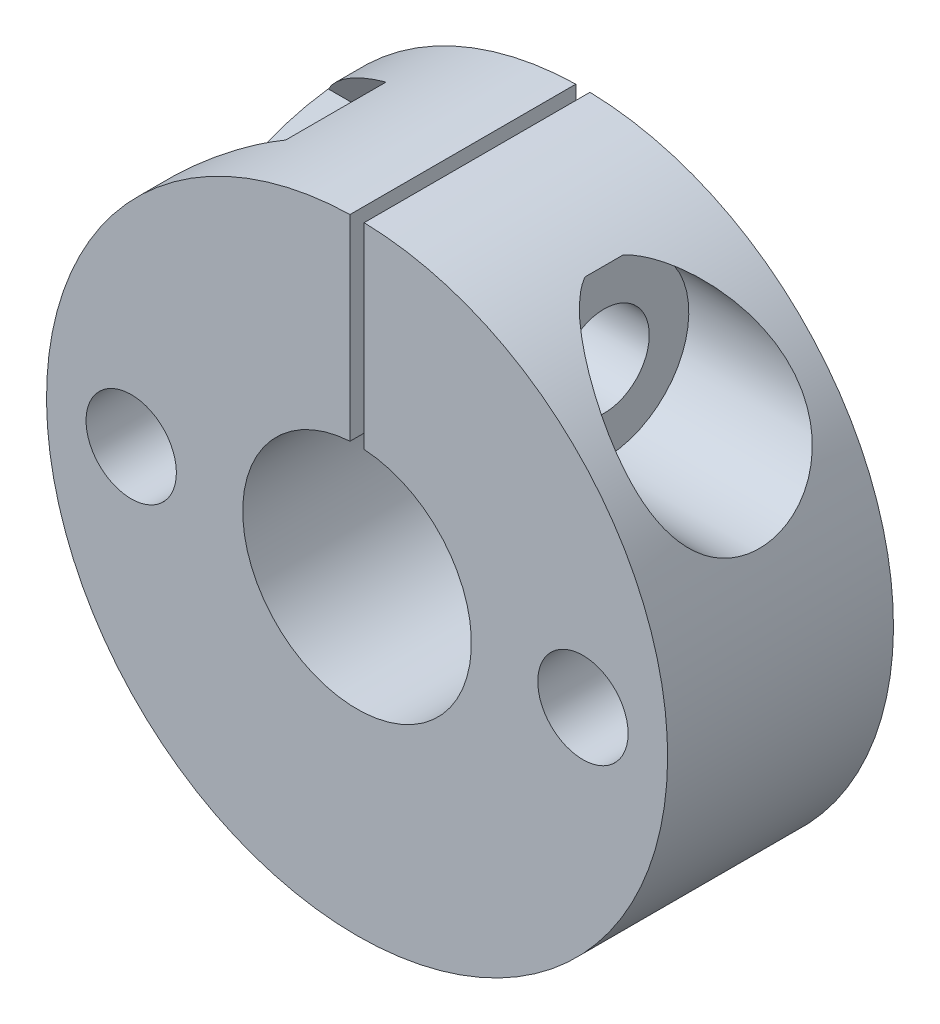
ISO-10303-21;
HEADER;
FILE_DESCRIPTION(('STEP AP214'),'2;1');
FILE_NAME('part.step','',(''),(''),'','','');
FILE_SCHEMA(('AUTOMOTIVE_DESIGN { 1 0 10303 214 1 1 1 1 }'));
ENDSEC;
DATA;
#1=APPLICATION_CONTEXT('core data for automotive mechanical design processes');
#2=APPLICATION_PROTOCOL_DEFINITION('international standard','automotive_design',2000,#1);
#3=PRODUCT_CONTEXT('',#1,'mechanical');
#4=PRODUCT('Part','Part','',(#3));
#5=PRODUCT_RELATED_PRODUCT_CATEGORY('part','',(#4));
#6=PRODUCT_DEFINITION_FORMATION('','',#4);
#7=PRODUCT_DEFINITION_CONTEXT('part definition',#1,'design');
#8=PRODUCT_DEFINITION('design','',#6,#7);
#9=PRODUCT_DEFINITION_SHAPE('','',#8);
#10=(LENGTH_UNIT() NAMED_UNIT(*) SI_UNIT(.MILLI.,.METRE.));
#11=(NAMED_UNIT(*) PLANE_ANGLE_UNIT() SI_UNIT($,.RADIAN.));
#12=(NAMED_UNIT(*) SI_UNIT($,.STERADIAN.) SOLID_ANGLE_UNIT());
#13=UNCERTAINTY_MEASURE_WITH_UNIT(LENGTH_MEASURE(1.E-05),#10,'distance_accuracy_value','');
#14=(GEOMETRIC_REPRESENTATION_CONTEXT(3) GLOBAL_UNCERTAINTY_ASSIGNED_CONTEXT((#13)) GLOBAL_UNIT_ASSIGNED_CONTEXT((#10,
#11,#12)) REPRESENTATION_CONTEXT('',''));
#15=CARTESIAN_POINT('',(0.,0.,0.));
#16=DIRECTION('',(0.,0.,1.));
#17=DIRECTION('',(1.,0.,0.));
#18=AXIS2_PLACEMENT_3D('',#15,#16,#17);
#19=CARTESIAN_POINT('',(0.,0.,8.));
#20=DIRECTION('',(0.,0.,-1.));
#21=DIRECTION('',(-1.,0.,0.));
#22=AXIS2_PLACEMENT_3D('',#19,#20,#21);
#23=CYLINDRICAL_SURFACE('',#22,11.);
#24=CARTESIAN_POINT('',(0.,0.,0.));
#25=DIRECTION('',(0.,0.,1.));
#26=DIRECTION('',(1.,0.,0.));
#27=AXIS2_PLACEMENT_3D('',#24,#25,#26);
#28=CIRCLE('',#27,11.);
#29=CARTESIAN_POINT('',(-0.25,10.9971587239614,0.));
#30=VERTEX_POINT('',#29);
#31=CARTESIAN_POINT('',(0.25,10.9971587239614,0.));
#32=VERTEX_POINT('',#31);
#33=EDGE_CURVE('E200',#30,#32,#28,.T.);
#34=ORIENTED_EDGE('',*,*,#33,.T.);
#35=DIRECTION('',(0.,0.,-1.));
#36=VECTOR('',#35,1.);
#37=CARTESIAN_POINT('',(0.25,10.9971587239614,8.));
#38=LINE('',#37,#36);
#39=CARTESIAN_POINT('',(0.25,10.9971587239614,8.));
#40=VERTEX_POINT('',#39);
#41=EDGE_CURVE('E206',#40,#32,#38,.T.);
#42=ORIENTED_EDGE('',*,*,#41,.F.);
#43=CARTESIAN_POINT('',(0.,0.,8.));
#44=DIRECTION('',(0.,0.,1.));
#45=DIRECTION('',(1.,0.,0.));
#46=AXIS2_PLACEMENT_3D('',#43,#44,#45);
#47=CIRCLE('',#46,11.);
#48=CARTESIAN_POINT('',(-0.25,10.9971587239614,8.));
#49=VERTEX_POINT('',#48);
#50=EDGE_CURVE('E186',#49,#40,#47,.T.);
#51=ORIENTED_EDGE('',*,*,#50,.F.);
#52=DIRECTION('',(0.,0.,-1.));
#53=VECTOR('',#52,1.);
#54=CARTESIAN_POINT('',(-0.25,10.9971587239614,8.));
#55=LINE('',#54,#53);
#56=EDGE_CURVE('E208',#49,#30,#55,.T.);
#57=ORIENTED_EDGE('',*,*,#56,.T.);
#58=EDGE_LOOP('',(#34,#42,#51,#57));
#59=FACE_BOUND('',#58,.T.);
#60=DIRECTION('',(0.,0.,-1.));
#61=VECTOR('',#60,1.);
#62=CARTESIAN_POINT('',(4.75,9.92156741649221,8.));
#63=LINE('',#62,#61);
#64=CARTESIAN_POINT('',(4.75,9.92156741649221,3.31849884013964));
#65=VERTEX_POINT('',#64);
#66=CARTESIAN_POINT('',(4.75,9.92156741649221,4.68150115986036));
#67=VERTEX_POINT('',#66);
#68=EDGE_CURVE('E212',#65,#67,#63,.F.);
#69=ORIENTED_EDGE('',*,*,#68,.F.);
#70=CARTESIAN_POINT('',(4.75,9.92156741649221,3.31849884013964));
#71=CARTESIAN_POINT('',(4.77022953811645,9.91188325670943,3.27699417539969));
#72=CARTESIAN_POINT('',(4.79181015938971,9.90147451358131,3.23635771362851));
#73=CARTESIAN_POINT('',(4.83723887895417,9.87936001471054,3.15679688138933));
#74=CARTESIAN_POINT('',(4.86108443262283,9.86765571212282,3.11787065977414));
#75=CARTESIAN_POINT('',(4.93519836182571,9.8309123152518,3.00385818391847));
#76=CARTESIAN_POINT('',(4.98824942404097,9.80414547360093,2.93113468938945));
#77=CARTESIAN_POINT('',(5.09877070098104,9.74712111644655,2.79214838970957));
#78=CARTESIAN_POINT('',(5.15618522884689,9.71690571677386,2.7258227464829));
#79=CARTESIAN_POINT('',(5.27455462621704,9.65316568511946,2.59792369143458));
#80=CARTESIAN_POINT('',(5.33551496823985,9.61963587882644,2.53635798637914));
#81=CARTESIAN_POINT('',(5.49981211330576,9.52710692300245,2.37932278922699));
#82=CARTESIAN_POINT('',(5.60520639277932,9.46558728264518,2.28749059186125));
#83=CARTESIAN_POINT('',(5.81955065230986,9.3353415897961,2.11374823811349));
#84=CARTESIAN_POINT('',(5.92850086532595,9.26661506450588,2.03183873345765));
#85=CARTESIAN_POINT('',(6.14917220305211,9.1216913965523,1.87636861110123));
#86=CARTESIAN_POINT('',(6.26090904879623,9.04543544388351,1.80288530271059));
#87=CARTESIAN_POINT('',(6.48497978971428,8.88616564793845,1.66472979996894));
#88=CARTESIAN_POINT('',(6.59731363720311,8.80315233703837,1.60005691256316));
#89=CARTESIAN_POINT('',(6.82837086122198,8.62530334316869,1.47594762315213));
#90=CARTESIAN_POINT('',(6.94707316725962,8.53005715519982,1.41705830668632));
#91=CARTESIAN_POINT('',(7.18312609047182,8.33225196723073,1.30968970912848));
#92=CARTESIAN_POINT('',(7.30047652415987,8.22969198781893,1.26121182576258));
#93=CARTESIAN_POINT('',(7.53242427552854,8.01792489866017,1.17567585952246));
#94=CARTESIAN_POINT('',(7.64703097696231,7.90874705405691,1.13857134692931));
#95=CARTESIAN_POINT('',(7.87298408813309,7.68385158575259,1.07665298181115));
#96=CARTESIAN_POINT('',(7.98433168759762,7.56813639485919,1.05183459026138));
#97=CARTESIAN_POINT('',(8.25390179154622,7.27522112575082,1.0074702952822));
#98=CARTESIAN_POINT('',(8.40979241445033,7.09449390634202,0.995768731289775));
#99=CARTESIAN_POINT('',(8.63406137624726,6.81668898914619,1.00417315243778));
#100=CARTESIAN_POINT('',(8.70723404648384,6.7229529374872,1.01130394434394));
#101=CARTESIAN_POINT('',(8.84995674258999,6.5339340121118,1.03489197837409));
#102=CARTESIAN_POINT('',(8.91950738396315,6.43865140484026,1.05134763020916));
#103=CARTESIAN_POINT('',(9.09795256978813,6.18579453626502,1.10812470225842));
#104=CARTESIAN_POINT('',(9.2034208065907,6.02752372050047,1.15698654671387));
#105=CARTESIAN_POINT('',(9.35152292968966,5.79289923599822,1.2522617836468));
#106=CARTESIAN_POINT('',(9.39922159531235,5.71512843338285,1.287699911992));
#107=CARTESIAN_POINT('',(9.49104864314502,5.56129344377812,1.36607504392381));
#108=CARTESIAN_POINT('',(9.53517879987885,5.48522842231939,1.40900828641812));
#109=CARTESIAN_POINT('',(9.61999082332197,5.33509862023165,1.50280142701932));
#110=CARTESIAN_POINT('',(9.66064308829401,5.26105408483691,1.55372057640828));
#111=CARTESIAN_POINT('',(9.7379249467123,5.11659296041257,1.66312574890519));
#112=CARTESIAN_POINT('',(9.77455647596265,5.04617463427175,1.72160810086508));
#113=CARTESIAN_POINT('',(9.8436962215956,4.90993711149285,1.84590187801453));
#114=CARTESIAN_POINT('',(9.87620487560973,4.84411742705562,1.91171252393139));
#115=CARTESIAN_POINT('',(9.93704086578531,4.71806293060332,2.05024874135895));
#116=CARTESIAN_POINT('',(9.96536880082459,4.65782731914392,2.12297332000686));
#117=CARTESIAN_POINT('',(10.0145503133919,4.55102131132973,2.26523913728561));
#118=CARTESIAN_POINT('',(10.0358956915019,4.50368442435537,2.33403687447065));
#119=CARTESIAN_POINT('',(10.0754218239449,4.41455014279456,2.47603207827206));
#120=CARTESIAN_POINT('',(10.0936014860295,4.37275466130882,2.54923105174887));
#121=CARTESIAN_POINT('',(10.126819740596,4.29526503698496,2.6994081809457));
#122=CARTESIAN_POINT('',(10.1418606135595,4.25956646789444,2.77638354236242));
#123=CARTESIAN_POINT('',(10.1688766465431,4.19466040082527,2.93355087202633));
#124=CARTESIAN_POINT('',(10.1808507167613,4.1654552107822,3.01374397203453));
#125=CARTESIAN_POINT('',(10.2108256863758,4.09167326364633,3.24706110272299));
#126=CARTESIAN_POINT('',(10.2251224195139,4.05555181965714,3.40345551227715));
#127=CARTESIAN_POINT('',(10.2435623137394,4.008748852791,3.72048884995111));
#128=CARTESIAN_POINT('',(10.2477071856331,3.99806304347271,3.88112705828715));
#129=CARTESIAN_POINT('',(10.2459858158441,4.0024711479941,4.19899457152184));
#130=CARTESIAN_POINT('',(10.2403055630777,4.01708612414667,4.35623138846707));
#131=CARTESIAN_POINT('',(10.2191486622101,4.07060408053511,4.66582188019068));
#132=CARTESIAN_POINT('',(10.2036725197159,4.10950580722873,4.81817580656909));
#133=CARTESIAN_POINT('',(10.1626082975605,4.21002577055388,5.11373477739537));
#134=CARTESIAN_POINT('',(10.1370206281218,4.27164308561212,5.25694019272258));
#135=CARTESIAN_POINT('',(10.0753741620848,4.4150764857234,5.53036156458894));
#136=CARTESIAN_POINT('',(10.0393155975651,4.49689212309131,5.66057780893638));
#137=CARTESIAN_POINT('',(9.95579289703684,4.67892598188559,5.90695293853804));
#138=CARTESIAN_POINT('',(9.90814582709727,4.77943257401806,6.02283619595269));
#139=CARTESIAN_POINT('',(9.80185504426019,4.99378929458557,6.23560796090967));
#140=CARTESIAN_POINT('',(9.74320951686556,5.10764162360204,6.3324933288265));
#141=CARTESIAN_POINT('',(9.61194240909983,5.35075893819629,6.51076342010563));
#142=CARTESIAN_POINT('',(9.53873863952403,5.48052359566094,6.59103370037715));
#143=CARTESIAN_POINT('',(9.38162765915621,5.74532778172129,6.72912602030643));
#144=CARTESIAN_POINT('',(9.29771719717527,5.88036890388803,6.78694121961032));
#145=CARTESIAN_POINT('',(9.11003401391512,6.16766219402998,6.88669121282202));
#146=CARTESIAN_POINT('',(9.00508592427376,6.32006682433309,6.92595087306125));
#147=CARTESIAN_POINT('',(8.78534663268319,6.62213196581027,6.98006780832495));
#148=CARTESIAN_POINT('',(8.67054689771324,6.77178995899322,6.99490369956167));
#149=CARTESIAN_POINT('',(8.46254112218328,7.02891406043816,7.00189491889584));
#150=CARTESIAN_POINT('',(8.37101393457288,7.13766323337853,6.99875101303284));
#151=CARTESIAN_POINT('',(8.1842471393386,7.35106793146673,6.98131101425953));
#152=CARTESIAN_POINT('',(8.0890060117652,7.45572174470644,6.96701030888351));
#153=CARTESIAN_POINT('',(7.89545681079125,7.66039377230054,6.92826628969606));
#154=CARTESIAN_POINT('',(7.79714540040735,7.76040662684249,6.90381155799769));
#155=CARTESIAN_POINT('',(7.59822010456184,7.95527728982136,6.8456604784817));
#156=CARTESIAN_POINT('',(7.4976064722551,8.05013566121658,6.81196514233765));
#157=CARTESIAN_POINT('',(7.29276194789595,8.23620858161955,6.73534354088064));
#158=CARTESIAN_POINT('',(7.18849863746788,8.32732008722015,6.69225452746064));
#159=CARTESIAN_POINT('',(6.97884684717501,8.50379163837081,6.59781223952895));
#160=CARTESIAN_POINT('',(6.8734582614413,8.58915113713368,6.54645818090784));
#161=CARTESIAN_POINT('',(6.66210767710776,8.75410273158133,6.43577561427193));
#162=CARTESIAN_POINT('',(6.55614511488468,8.83368725920256,6.37643692292472));
#163=CARTESIAN_POINT('',(6.3445629575204,8.98685513537516,6.24994998409871));
#164=CARTESIAN_POINT('',(6.23894330697778,9.06043950492885,6.1828030700247));
#165=CARTESIAN_POINT('',(6.05629553528247,9.18313952095782,6.05897925234754));
#166=CARTESIAN_POINT('',(5.97896783778271,9.23364570029721,6.00411401445009));
#167=CARTESIAN_POINT('',(5.82556013884625,9.33118985656786,5.88976276079497));
#168=CARTESIAN_POINT('',(5.74947992433258,9.37822843068614,5.83027754432549));
#169=CARTESIAN_POINT('',(5.59967906376376,9.46843149917224,5.70665441618665));
#170=CARTESIAN_POINT('',(5.52594752177277,9.51161636500401,5.64254466647598));
#171=CARTESIAN_POINT('',(5.38135040038943,9.59416422730156,5.50880497249617));
#172=CARTESIAN_POINT('',(5.3104848602967,9.63352717137017,5.43917495256985));
#173=CARTESIAN_POINT('',(5.19466096063018,9.69630745293377,5.31646028025701));
#174=CARTESIAN_POINT('',(5.1485516037649,9.72085219239875,5.26504094342154));
#175=CARTESIAN_POINT('',(5.05910399072818,9.76770258443399,5.15895709260151));
#176=CARTESIAN_POINT('',(5.0157630354226,9.79001043040928,5.10429584290776));
#177=CARTESIAN_POINT('',(4.93229832853585,9.83232569495096,4.99077860855563));
#178=CARTESIAN_POINT('',(4.89220947788209,9.85230895905587,4.93188737534912));
#179=CARTESIAN_POINT('',(4.816986083699,9.88931006908049,4.80989641862167));
#180=CARTESIAN_POINT('',(4.7818674304895,9.90631844305301,4.74678410641792));
#181=CARTESIAN_POINT('',(4.75,9.92156741649222,4.68150115986036));
#182=B_SPLINE_CURVE_WITH_KNOTS('',3,(#70,#71,#72,#73,#74,#75,#76,#77,#78,#79,#80,#81,#82,#83,
#84,#85,#86,#87,#88,#89,#90,#91,#92,#93,#94,#95,#96,#97,#98,#99,#100,#101,#102,#103,#104,#105,
#106,#107,#108,#109,#110,#111,#112,#113,#114,#115,#116,#117,#118,#119,#120,#121,#122,#123,#124,
#125,#126,#127,#128,#129,#130,#131,#132,#133,#134,#135,#136,#137,#138,#139,#140,#141,#142,#143,
#144,#145,#146,#147,#148,#149,#150,#151,#152,#153,#154,#155,#156,#157,#158,#159,#160,#161,#162,
#163,#164,#165,#166,#167,#168,#169,#170,#171,#172,#173,#174,#175,#176,#177,#178,#179,#180,#181),
.UNSPECIFIED.,.F.,.F.,(4,2,2,2,2,2,2,2,2,2,2,2,2,2,2,2,2,2,2,2,2,2,2,2,2,2,2,2,2,2,2,2,2,2,2,2,
2,2,2,2,2,2,2,2,2,2,2,2,2,2,2,2,2,2,2,4),(0.,0.141442599499457,0.282728128466706,
0.563919482445042,0.841984697423091,1.12049108587166,1.5779733694597,2.03548568438359,
2.49690684519556,2.95829168821673,3.44736224938494,3.93649842687927,4.42361035140929,
4.91054218116307,5.62434819417653,5.9813644539928,6.33831984552668,6.92457501644764,
7.21790440726603,7.51108702456771,7.80655789758697,8.10188588479022,8.39718249747988,
8.69243676850337,8.95068407039872,9.20902029805753,9.46716817344348,9.7254076559266,
10.2062854686224,10.6870822375172,11.1588768619326,11.6306471370387,12.102398274492,
12.5741389567695,13.0538742172614,13.5336886929727,14.0393186593458,14.5451025321003,
15.1105042510219,15.6764007343979,16.1023810510912,16.5285375707787,16.955174593567,
17.3817649262051,17.8164349666676,18.2511462688517,18.6864173370137,19.1216141830931,
19.4437535964279,19.7658374010392,20.0861029254039,20.4063728398751,20.6261331724526,
20.8456758655234,21.0673273323736,21.2896721676992),.UNSPECIFIED.);
#183=EDGE_CURVE('E44',#65,#67,#182,.T.);
#184=ORIENTED_EDGE('',*,*,#183,.T.);
#185=EDGE_LOOP('',(#69,#184));
#186=FACE_BOUND('',#185,.T.);
#187=DIRECTION('',(0.,0.,-1.));
#188=VECTOR('',#187,1.);
#189=CARTESIAN_POINT('',(-4.75,9.92156741649221,8.));
#190=LINE('',#189,#188);
#191=CARTESIAN_POINT('',(-4.75,9.92156741649221,5.77733388077033));
#192=VERTEX_POINT('',#191);
#193=CARTESIAN_POINT('',(-4.75,9.92156741649221,2.22266611922966));
#194=VERTEX_POINT('',#193);
#195=EDGE_CURVE('E11',#192,#194,#190,.T.);
#196=ORIENTED_EDGE('',*,*,#195,.F.);
#197=CARTESIAN_POINT('',(0.,0.,11.5055534994651));
#198=DIRECTION('',(0.,-0.5,-0.866025403784438));
#199=DIRECTION('',(0.,0.866025403784438,-0.5));
#200=AXIS2_PLACEMENT_3D('',#197,#198,#199);
#201=ELLIPSE('',#200,12.7017059221718,11.);
#202=CARTESIAN_POINT('',(-8.48528137423857,7.,7.46410161513776));
#203=VERTEX_POINT('',#202);
#204=EDGE_CURVE('E140',#203,#192,#201,.T.);
#205=ORIENTED_EDGE('',*,*,#204,.F.);
#206=CARTESIAN_POINT('',(0.,0.,3.42264973081038));
#207=DIRECTION('',(0.,0.5,-0.866025403784439));
#208=DIRECTION('',(0.,-0.866025403784439,-0.5));
#209=AXIS2_PLACEMENT_3D('',#206,#207,#208);
#210=ELLIPSE('',#209,12.7017059221718,11.);
#211=CARTESIAN_POINT('',(-10.2469507659596,4.,5.73205080756888));
#212=VERTEX_POINT('',#211);
#213=EDGE_CURVE('E133',#212,#203,#210,.T.);
#214=ORIENTED_EDGE('',*,*,#213,.F.);
#215=DIRECTION('',(0.,0.,-1.));
#216=VECTOR('',#215,1.);
#217=CARTESIAN_POINT('',(-10.2469507659596,4.,8.));
#218=LINE('',#217,#216);
#219=CARTESIAN_POINT('',(-10.2469507659596,4.,2.26794919243112));
#220=VERTEX_POINT('',#219);
#221=EDGE_CURVE('E136',#220,#212,#218,.F.);
#222=ORIENTED_EDGE('',*,*,#221,.F.);
#223=CARTESIAN_POINT('',(0.,0.,4.57735026918962));
#224=DIRECTION('',(0.,0.5,0.866025403784439));
#225=DIRECTION('',(0.,0.866025403784439,-0.5));
#226=AXIS2_PLACEMENT_3D('',#223,#224,#225);
#227=ELLIPSE('',#226,12.7017059221718,11.);
#228=CARTESIAN_POINT('',(-8.48528137423858,7.,0.535898384862245));
#229=VERTEX_POINT('',#228);
#230=EDGE_CURVE('E157',#229,#220,#227,.T.);
#231=ORIENTED_EDGE('',*,*,#230,.F.);
#232=CARTESIAN_POINT('',(0.,0.,-3.50555349946513));
#233=DIRECTION('',(0.,-0.5,0.866025403784439));
#234=DIRECTION('',(0.,-0.866025403784439,-0.5));
#235=AXIS2_PLACEMENT_3D('',#232,#233,#234);
#236=ELLIPSE('',#235,12.7017059221718,11.);
#237=EDGE_CURVE('E159',#194,#229,#236,.T.);
#238=ORIENTED_EDGE('',*,*,#237,.F.);
#239=EDGE_LOOP('',(#196,#205,#214,#222,#231,#238));
#240=FACE_BOUND('',#239,.T.);
#241=ADVANCED_FACE('F35',(#59,#186,#240),#23,.T.);
#242=CARTESIAN_POINT('',(0.,0.,8.));
#243=DIRECTION('',(0.,0.,-1.));
#244=DIRECTION('',(-1.,0.,0.));
#245=AXIS2_PLACEMENT_3D('',#242,#243,#244);
#246=CYLINDRICAL_SURFACE('',#245,4.05);
#247=CARTESIAN_POINT('',(0.,0.,0.));
#248=DIRECTION('',(0.,0.,1.));
#249=DIRECTION('',(1.,0.,0.));
#250=AXIS2_PLACEMENT_3D('',#247,#248,#249);
#251=CIRCLE('',#250,4.05);
#252=CARTESIAN_POINT('',(-0.25,4.04227658628155,0.));
#253=VERTEX_POINT('',#252);
#254=CARTESIAN_POINT('',(0.25,4.04227658628155,0.));
#255=VERTEX_POINT('',#254);
#256=EDGE_CURVE('E195',#253,#255,#251,.T.);
#257=ORIENTED_EDGE('',*,*,#256,.F.);
#258=DIRECTION('',(0.,0.,-1.));
#259=VECTOR('',#258,1.);
#260=CARTESIAN_POINT('',(-0.25,4.04227658628155,8.));
#261=LINE('',#260,#259);
#262=CARTESIAN_POINT('',(-0.25,4.04227658628155,8.));
#263=VERTEX_POINT('',#262);
#264=EDGE_CURVE('E82',#263,#253,#261,.T.);
#265=ORIENTED_EDGE('',*,*,#264,.F.);
#266=CARTESIAN_POINT('',(0.,0.,8.));
#267=DIRECTION('',(0.,0.,1.));
#268=DIRECTION('',(1.,0.,0.));
#269=AXIS2_PLACEMENT_3D('',#266,#267,#268);
#270=CIRCLE('',#269,4.05);
#271=CARTESIAN_POINT('',(0.25,4.04227658628155,8.));
#272=VERTEX_POINT('',#271);
#273=EDGE_CURVE('E181',#263,#272,#270,.T.);
#274=ORIENTED_EDGE('',*,*,#273,.T.);
#275=DIRECTION('',(0.,0.,-1.));
#276=VECTOR('',#275,1.);
#277=CARTESIAN_POINT('',(0.25,4.04227658628155,8.));
#278=LINE('',#277,#276);
#279=EDGE_CURVE('E59',#272,#255,#278,.T.);
#280=ORIENTED_EDGE('',*,*,#279,.T.);
#281=EDGE_LOOP('',(#257,#265,#274,#280));
#282=FACE_BOUND('',#281,.T.);
#283=ADVANCED_FACE('F249',(#282),#246,.F.);
#284=CARTESIAN_POINT('',(-0.25,0.,8.));
#285=DIRECTION('',(-1.,0.,0.));
#286=DIRECTION('',(0.,-1.,0.));
#287=AXIS2_PLACEMENT_3D('',#284,#285,#286);
#288=PLANE('',#287);
#289=CARTESIAN_POINT('',(-0.25,7.,4.));
#290=DIRECTION('',(-1.,0.,0.));
#291=DIRECTION('',(0.,-1.,0.));
#292=AXIS2_PLACEMENT_3D('',#289,#290,#291);
#293=CIRCLE('',#292,1.6);
#294=CARTESIAN_POINT('',(-0.25,5.4,4.));
#295=VERTEX_POINT('',#294);
#296=EDGE_CURVE('E169',#295,#295,#293,.T.);
#297=ORIENTED_EDGE('',*,*,#296,.T.);
#298=EDGE_LOOP('',(#297));
#299=FACE_BOUND('',#298,.T.);
#300=DIRECTION('',(0.,1.,0.));
#301=VECTOR('',#300,1.);
#302=CARTESIAN_POINT('',(-0.25,0.,0.));
#303=LINE('',#302,#301);
#304=EDGE_CURVE('E197',#253,#30,#303,.T.);
#305=ORIENTED_EDGE('',*,*,#304,.T.);
#306=ORIENTED_EDGE('',*,*,#56,.F.);
#307=DIRECTION('',(0.,1.,0.));
#308=VECTOR('',#307,1.);
#309=CARTESIAN_POINT('',(-0.25,0.,8.));
#310=LINE('',#309,#308);
#311=EDGE_CURVE('E183',#263,#49,#310,.T.);
#312=ORIENTED_EDGE('',*,*,#311,.F.);
#313=ORIENTED_EDGE('',*,*,#264,.T.);
#314=EDGE_LOOP('',(#305,#306,#312,#313));
#315=FACE_BOUND('',#314,.T.);
#316=ADVANCED_FACE('F254',(#299,#315),#288,.F.);
#317=CARTESIAN_POINT('',(-8.,0.,8.));
#318=DIRECTION('',(0.,0.,-1.));
#319=DIRECTION('',(-1.,0.,0.));
#320=AXIS2_PLACEMENT_3D('',#317,#318,#319);
#321=CYLINDRICAL_SURFACE('',#320,1.6);
#322=CARTESIAN_POINT('',(-8.,0.,8.));
#323=DIRECTION('',(0.,0.,1.));
#324=DIRECTION('',(1.,0.,0.));
#325=AXIS2_PLACEMENT_3D('',#322,#323,#324);
#326=CIRCLE('',#325,1.6);
#327=CARTESIAN_POINT('',(-6.4,0.,8.));
#328=VERTEX_POINT('',#327);
#329=EDGE_CURVE('E177',#328,#328,#326,.T.);
#330=ORIENTED_EDGE('',*,*,#329,.T.);
#331=EDGE_LOOP('',(#330));
#332=FACE_BOUND('',#331,.T.);
#333=CARTESIAN_POINT('',(-8.,0.,0.));
#334=DIRECTION('',(0.,0.,1.));
#335=DIRECTION('',(1.,0.,0.));
#336=AXIS2_PLACEMENT_3D('',#333,#334,#335);
#337=CIRCLE('',#336,1.6);
#338=CARTESIAN_POINT('',(-6.4,0.,0.));
#339=VERTEX_POINT('',#338);
#340=EDGE_CURVE('E192',#339,#339,#337,.T.);
#341=ORIENTED_EDGE('',*,*,#340,.F.);
#342=EDGE_LOOP('',(#341));
#343=FACE_BOUND('',#342,.T.);
#344=ADVANCED_FACE('F245',(#332,#343),#321,.F.);
#345=CARTESIAN_POINT('',(8.,0.,8.));
#346=DIRECTION('',(0.,0.,-1.));
#347=DIRECTION('',(-1.,0.,0.));
#348=AXIS2_PLACEMENT_3D('',#345,#346,#347);
#349=CYLINDRICAL_SURFACE('',#348,1.6);
#350=CARTESIAN_POINT('',(8.,0.,8.));
#351=DIRECTION('',(0.,0.,1.));
#352=DIRECTION('',(1.,0.,0.));
#353=AXIS2_PLACEMENT_3D('',#350,#351,#352);
#354=CIRCLE('',#353,1.6);
#355=CARTESIAN_POINT('',(9.6,0.,8.));
#356=VERTEX_POINT('',#355);
#357=EDGE_CURVE('E174',#356,#356,#354,.T.);
#358=ORIENTED_EDGE('',*,*,#357,.T.);
#359=EDGE_LOOP('',(#358));
#360=FACE_BOUND('',#359,.T.);
#361=CARTESIAN_POINT('',(8.,0.,0.));
#362=DIRECTION('',(0.,0.,1.));
#363=DIRECTION('',(1.,0.,0.));
#364=AXIS2_PLACEMENT_3D('',#361,#362,#363);
#365=CIRCLE('',#364,1.6);
#366=CARTESIAN_POINT('',(9.6,0.,0.));
#367=VERTEX_POINT('',#366);
#368=EDGE_CURVE('E173',#367,#367,#365,.T.);
#369=ORIENTED_EDGE('',*,*,#368,.F.);
#370=EDGE_LOOP('',(#369));
#371=FACE_BOUND('',#370,.T.);
#372=ADVANCED_FACE('F37',(#360,#371),#349,.F.);
#373=CARTESIAN_POINT('',(0.25,0.,8.));
#374=DIRECTION('',(-1.,0.,0.));
#375=DIRECTION('',(0.,0.,1.));
#376=AXIS2_PLACEMENT_3D('',#373,#374,#375);
#377=PLANE('',#376);
#378=CARTESIAN_POINT('',(0.25,7.,4.));
#379=DIRECTION('',(-1.,0.,0.));
#380=DIRECTION('',(0.,0.,1.));
#381=AXIS2_PLACEMENT_3D('',#378,#379,#380);
#382=CIRCLE('',#381,1.6);
#383=CARTESIAN_POINT('',(0.25,7.,5.6));
#384=VERTEX_POINT('',#383);
#385=EDGE_CURVE('E166',#384,#384,#382,.T.);
#386=ORIENTED_EDGE('',*,*,#385,.F.);
#387=EDGE_LOOP('',(#386));
#388=FACE_BOUND('',#387,.T.);
#389=DIRECTION('',(0.,1.,0.));
#390=VECTOR('',#389,1.);
#391=CARTESIAN_POINT('',(0.25,0.,0.));
#392=LINE('',#391,#390);
#393=EDGE_CURVE('E178',#255,#32,#392,.T.);
#394=ORIENTED_EDGE('',*,*,#393,.F.);
#395=ORIENTED_EDGE('',*,*,#279,.F.);
#396=DIRECTION('',(0.,1.,0.));
#397=VECTOR('',#396,1.);
#398=CARTESIAN_POINT('',(0.25,0.,8.));
#399=LINE('',#398,#397);
#400=EDGE_CURVE('E188',#272,#40,#399,.T.);
#401=ORIENTED_EDGE('',*,*,#400,.T.);
#402=ORIENTED_EDGE('',*,*,#41,.T.);
#403=EDGE_LOOP('',(#394,#395,#401,#402));
#404=FACE_BOUND('',#403,.T.);
#405=ADVANCED_FACE('F236',(#388,#404),#377,.T.);
#406=CARTESIAN_POINT('',(0.,0.,8.));
#407=DIRECTION('',(0.,0.,1.));
#408=DIRECTION('',(1.,0.,0.));
#409=AXIS2_PLACEMENT_3D('',#406,#407,#408);
#410=PLANE('',#409);
#411=ORIENTED_EDGE('',*,*,#357,.F.);
#412=EDGE_LOOP('',(#411));
#413=FACE_BOUND('',#412,.T.);
#414=ORIENTED_EDGE('',*,*,#329,.F.);
#415=EDGE_LOOP('',(#414));
#416=FACE_BOUND('',#415,.T.);
#417=ORIENTED_EDGE('',*,*,#273,.F.);
#418=ORIENTED_EDGE('',*,*,#311,.T.);
#419=ORIENTED_EDGE('',*,*,#50,.T.);
#420=ORIENTED_EDGE('',*,*,#400,.F.);
#421=EDGE_LOOP('',(#417,#418,#419,#420));
#422=FACE_BOUND('',#421,.T.);
#423=ADVANCED_FACE('F233',(#413,#416,#422),#410,.T.);
#424=CARTESIAN_POINT('',(0.,0.,0.));
#425=DIRECTION('',(0.,0.,1.));
#426=DIRECTION('',(1.,0.,0.));
#427=AXIS2_PLACEMENT_3D('',#424,#425,#426);
#428=PLANE('',#427);
#429=ORIENTED_EDGE('',*,*,#368,.T.);
#430=EDGE_LOOP('',(#429));
#431=FACE_BOUND('',#430,.T.);
#432=ORIENTED_EDGE('',*,*,#340,.T.);
#433=EDGE_LOOP('',(#432));
#434=FACE_BOUND('',#433,.T.);
#435=ORIENTED_EDGE('',*,*,#256,.T.);
#436=ORIENTED_EDGE('',*,*,#393,.T.);
#437=ORIENTED_EDGE('',*,*,#33,.F.);
#438=ORIENTED_EDGE('',*,*,#304,.F.);
#439=EDGE_LOOP('',(#435,#436,#437,#438));
#440=FACE_BOUND('',#439,.T.);
#441=ADVANCED_FACE('F230',(#431,#434,#440),#428,.F.);
#442=CARTESIAN_POINT('',(4.75,7.,4.));
#443=DIRECTION('',(1.,0.,0.));
#444=DIRECTION('',(0.,1.,0.));
#445=AXIS2_PLACEMENT_3D('',#442,#443,#444);
#446=CYLINDRICAL_SURFACE('',#445,3.);
#447=CARTESIAN_POINT('',(4.75,7.,4.));
#448=DIRECTION('',(1.,0.,0.));
#449=DIRECTION('',(0.,1.,0.));
#450=AXIS2_PLACEMENT_3D('',#447,#448,#449);
#451=CIRCLE('',#450,3.);
#452=EDGE_CURVE('E50',#67,#65,#451,.T.);
#453=ORIENTED_EDGE('',*,*,#452,.F.);
#454=ORIENTED_EDGE('',*,*,#183,.F.);
#455=EDGE_LOOP('',(#453,#454));
#456=FACE_BOUND('',#455,.T.);
#457=ADVANCED_FACE('F224',(#456),#446,.F.);
#458=CARTESIAN_POINT('',(4.75,7.,4.));
#459=DIRECTION('',(1.,0.,0.));
#460=DIRECTION('',(0.,1.,0.));
#461=AXIS2_PLACEMENT_3D('',#458,#459,#460);
#462=PLANE('',#461);
#463=CARTESIAN_POINT('',(4.75,7.,4.));
#464=DIRECTION('',(1.,0.,0.));
#465=DIRECTION('',(0.,1.,0.));
#466=AXIS2_PLACEMENT_3D('',#463,#464,#465);
#467=CIRCLE('',#466,1.6);
#468=CARTESIAN_POINT('',(4.75,8.6,4.));
#469=VERTEX_POINT('',#468);
#470=EDGE_CURVE('E163',#469,#469,#467,.T.);
#471=ORIENTED_EDGE('',*,*,#470,.F.);
#472=EDGE_LOOP('',(#471));
#473=FACE_BOUND('',#472,.T.);
#474=ORIENTED_EDGE('',*,*,#68,.T.);
#475=ORIENTED_EDGE('',*,*,#452,.T.);
#476=EDGE_LOOP('',(#474,#475));
#477=FACE_BOUND('',#476,.T.);
#478=ADVANCED_FACE('F229',(#473,#477),#462,.T.);
#479=CARTESIAN_POINT('',(-4.75,7.,4.));
#480=DIRECTION('',(-1.,0.,0.));
#481=DIRECTION('',(0.,1.,0.));
#482=AXIS2_PLACEMENT_3D('',#479,#480,#481);
#483=PLANE('',#482);
#484=CARTESIAN_POINT('',(-4.75,7.,4.));
#485=DIRECTION('',(-1.,0.,0.));
#486=DIRECTION('',(0.,-1.,0.));
#487=AXIS2_PLACEMENT_3D('',#484,#485,#486);
#488=CIRCLE('',#487,1.6);
#489=CARTESIAN_POINT('',(-4.75,5.4,4.));
#490=VERTEX_POINT('',#489);
#491=EDGE_CURVE('E39',#490,#490,#488,.T.);
#492=ORIENTED_EDGE('',*,*,#491,.F.);
#493=EDGE_LOOP('',(#492));
#494=FACE_BOUND('',#493,.T.);
#495=ORIENTED_EDGE('',*,*,#195,.T.);
#496=DIRECTION('',(0.,-0.866025403784439,-0.5));
#497=VECTOR('',#496,1.);
#498=CARTESIAN_POINT('',(-4.75,10.,2.26794919243112));
#499=LINE('',#498,#497);
#500=CARTESIAN_POINT('',(-4.75,7.,0.535898384862245));
#501=VERTEX_POINT('',#500);
#502=EDGE_CURVE('E142',#194,#501,#499,.T.);
#503=ORIENTED_EDGE('',*,*,#502,.T.);
#504=DIRECTION('',(0.,-0.866025403784439,0.5));
#505=VECTOR('',#504,1.);
#506=CARTESIAN_POINT('',(-4.75,7.,0.535898384862245));
#507=LINE('',#506,#505);
#508=CARTESIAN_POINT('',(-4.75,4.,2.26794919243112));
#509=VERTEX_POINT('',#508);
#510=EDGE_CURVE('E144',#501,#509,#507,.T.);
#511=ORIENTED_EDGE('',*,*,#510,.T.);
#512=DIRECTION('',(0.,0.,1.));
#513=VECTOR('',#512,1.);
#514=CARTESIAN_POINT('',(-4.75,4.,2.26794919243112));
#515=LINE('',#514,#513);
#516=CARTESIAN_POINT('',(-4.75,4.,5.73205080756888));
#517=VERTEX_POINT('',#516);
#518=EDGE_CURVE('E124',#509,#517,#515,.T.);
#519=ORIENTED_EDGE('',*,*,#518,.T.);
#520=DIRECTION('',(0.,0.866025403784439,0.5));
#521=VECTOR('',#520,1.);
#522=CARTESIAN_POINT('',(-4.75,4.,5.73205080756888));
#523=LINE('',#522,#521);
#524=CARTESIAN_POINT('',(-4.75,7.,7.46410161513776));
#525=VERTEX_POINT('',#524);
#526=EDGE_CURVE('E118',#517,#525,#523,.T.);
#527=ORIENTED_EDGE('',*,*,#526,.T.);
#528=DIRECTION('',(0.,0.866025403784439,-0.5));
#529=VECTOR('',#528,1.);
#530=CARTESIAN_POINT('',(-4.75,7.,7.46410161513776));
#531=LINE('',#530,#529);
#532=EDGE_CURVE('E122',#525,#192,#531,.T.);
#533=ORIENTED_EDGE('',*,*,#532,.T.);
#534=EDGE_LOOP('',(#495,#503,#511,#519,#527,#533));
#535=FACE_BOUND('',#534,.T.);
#536=ADVANCED_FACE('F120',(#494,#535),#483,.T.);
#537=CARTESIAN_POINT('',(-11.,7.,4.));
#538=DIRECTION('',(1.,0.,0.));
#539=DIRECTION('',(0.,1.,0.));
#540=AXIS2_PLACEMENT_3D('',#537,#538,#539);
#541=CYLINDRICAL_SURFACE('',#540,1.6);
#542=ORIENTED_EDGE('',*,*,#491,.T.);
#543=EDGE_LOOP('',(#542));
#544=FACE_BOUND('',#543,.T.);
#545=ORIENTED_EDGE('',*,*,#296,.F.);
#546=EDGE_LOOP('',(#545));
#547=FACE_BOUND('',#546,.T.);
#548=ADVANCED_FACE('F288',(#544,#547),#541,.F.);
#549=ORIENTED_EDGE('',*,*,#385,.T.);
#550=EDGE_LOOP('',(#549));
#551=FACE_BOUND('',#550,.T.);
#552=ORIENTED_EDGE('',*,*,#470,.T.);
#553=EDGE_LOOP('',(#552));
#554=FACE_BOUND('',#553,.T.);
#555=ADVANCED_FACE('F286',(#551,#554),#541,.F.);
#556=CARTESIAN_POINT('',(-14.75,4.,5.73205080756888));
#557=DIRECTION('',(0.,0.5,-0.866025403784439));
#558=DIRECTION('',(0.,0.866025403784439,0.5));
#559=AXIS2_PLACEMENT_3D('',#556,#557,#558);
#560=PLANE('',#559);
#561=ORIENTED_EDGE('',*,*,#213,.T.);
#562=DIRECTION('',(1.,0.,0.));
#563=VECTOR('',#562,1.);
#564=CARTESIAN_POINT('',(-14.75,7.,7.46410161513776));
#565=LINE('',#564,#563);
#566=EDGE_CURVE('E130',#203,#525,#565,.T.);
#567=ORIENTED_EDGE('',*,*,#566,.T.);
#568=ORIENTED_EDGE('',*,*,#526,.F.);
#569=DIRECTION('',(1.,0.,0.));
#570=VECTOR('',#569,1.);
#571=CARTESIAN_POINT('',(-14.75,4.,5.73205080756888));
#572=LINE('',#571,#570);
#573=EDGE_CURVE('E149',#212,#517,#572,.T.);
#574=ORIENTED_EDGE('',*,*,#573,.F.);
#575=EDGE_LOOP('',(#561,#567,#568,#574));
#576=FACE_BOUND('',#575,.T.);
#577=ADVANCED_FACE('F131',(#576),#560,.T.);
#578=CARTESIAN_POINT('',(-14.75,7.,7.46410161513776));
#579=DIRECTION('',(0.,-0.5,-0.866025403784438));
#580=DIRECTION('',(0.,0.866025403784438,-0.5));
#581=AXIS2_PLACEMENT_3D('',#578,#579,#580);
#582=PLANE('',#581);
#583=ORIENTED_EDGE('',*,*,#204,.T.);
#584=ORIENTED_EDGE('',*,*,#532,.F.);
#585=ORIENTED_EDGE('',*,*,#566,.F.);
#586=EDGE_LOOP('',(#583,#584,#585));
#587=FACE_BOUND('',#586,.T.);
#588=ADVANCED_FACE('F139',(#587),#582,.T.);
#589=CARTESIAN_POINT('',(-14.75,10.,2.26794919243112));
#590=DIRECTION('',(0.,-0.5,0.866025403784439));
#591=DIRECTION('',(0.,-0.866025403784439,-0.5));
#592=AXIS2_PLACEMENT_3D('',#589,#590,#591);
#593=PLANE('',#592);
#594=ORIENTED_EDGE('',*,*,#237,.T.);
#595=DIRECTION('',(1.,0.,0.));
#596=VECTOR('',#595,1.);
#597=CARTESIAN_POINT('',(-14.75,7.,0.535898384862245));
#598=LINE('',#597,#596);
#599=EDGE_CURVE('E137',#229,#501,#598,.T.);
#600=ORIENTED_EDGE('',*,*,#599,.T.);
#601=ORIENTED_EDGE('',*,*,#502,.F.);
#602=EDGE_LOOP('',(#594,#600,#601));
#603=FACE_BOUND('',#602,.T.);
#604=ADVANCED_FACE('F264',(#603),#593,.T.);
#605=CARTESIAN_POINT('',(-14.75,7.,0.535898384862245));
#606=DIRECTION('',(0.,0.5,0.866025403784439));
#607=DIRECTION('',(0.,-0.866025403784439,0.5));
#608=AXIS2_PLACEMENT_3D('',#605,#606,#607);
#609=PLANE('',#608);
#610=ORIENTED_EDGE('',*,*,#230,.T.);
#611=DIRECTION('',(1.,0.,0.));
#612=VECTOR('',#611,1.);
#613=CARTESIAN_POINT('',(-14.75,4.,2.26794919243112));
#614=LINE('',#613,#612);
#615=EDGE_CURVE('E151',#220,#509,#614,.T.);
#616=ORIENTED_EDGE('',*,*,#615,.T.);
#617=ORIENTED_EDGE('',*,*,#510,.F.);
#618=ORIENTED_EDGE('',*,*,#599,.F.);
#619=EDGE_LOOP('',(#610,#616,#617,#618));
#620=FACE_BOUND('',#619,.T.);
#621=ADVANCED_FACE('F268',(#620),#609,.T.);
#622=CARTESIAN_POINT('',(-14.75,4.,2.26794919243112));
#623=DIRECTION('',(0.,1.,0.));
#624=DIRECTION('',(-1.,0.,0.));
#625=AXIS2_PLACEMENT_3D('',#622,#623,#624);
#626=PLANE('',#625);
#627=ORIENTED_EDGE('',*,*,#221,.T.);
#628=ORIENTED_EDGE('',*,*,#573,.T.);
#629=ORIENTED_EDGE('',*,*,#518,.F.);
#630=ORIENTED_EDGE('',*,*,#615,.F.);
#631=EDGE_LOOP('',(#627,#628,#629,#630));
#632=FACE_BOUND('',#631,.T.);
#633=ADVANCED_FACE('F272',(#632),#626,.T.);
#634=CLOSED_SHELL('',(#241,#283,#316,#344,#372,#405,#423,#441,#457,#478,#536,#548,#555,#577,
#588,#604,#621,#633));
#635=MANIFOLD_SOLID_BREP('B2',#634);
#636=ADVANCED_BREP_SHAPE_REPRESENTATION('',(#18,#635),#14);
#637=SHAPE_DEFINITION_REPRESENTATION(#9,#636);
ENDSEC;
END-ISO-10303-21;
